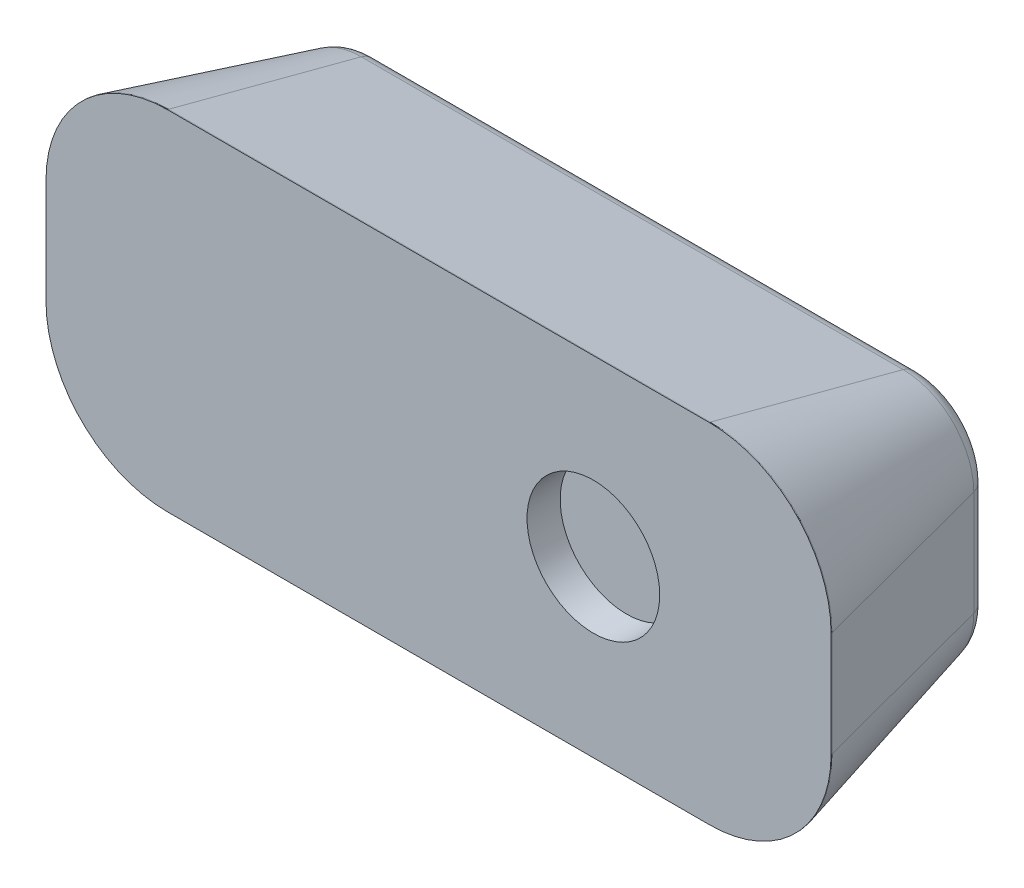
ISO-10303-21;
HEADER;
FILE_DESCRIPTION(('STEP AP214'),'2;1');
FILE_NAME('part.step','',(''),(''),'','','');
FILE_SCHEMA(('AUTOMOTIVE_DESIGN { 1 0 10303 214 1 1 1 1 }'));
ENDSEC;
DATA;
#1=APPLICATION_CONTEXT('core data for automotive mechanical design processes');
#2=APPLICATION_PROTOCOL_DEFINITION('international standard','automotive_design',2000,#1);
#3=PRODUCT_CONTEXT('',#1,'mechanical');
#4=PRODUCT('Part','Part','',(#3));
#5=PRODUCT_RELATED_PRODUCT_CATEGORY('part','',(#4));
#6=PRODUCT_DEFINITION_FORMATION('','',#4);
#7=PRODUCT_DEFINITION_CONTEXT('part definition',#1,'design');
#8=PRODUCT_DEFINITION('design','',#6,#7);
#9=PRODUCT_DEFINITION_SHAPE('','',#8);
#10=(LENGTH_UNIT() NAMED_UNIT(*) SI_UNIT(.MILLI.,.METRE.));
#11=(NAMED_UNIT(*) PLANE_ANGLE_UNIT() SI_UNIT($,.RADIAN.));
#12=(NAMED_UNIT(*) SI_UNIT($,.STERADIAN.) SOLID_ANGLE_UNIT());
#13=UNCERTAINTY_MEASURE_WITH_UNIT(LENGTH_MEASURE(1.E-05),#10,'distance_accuracy_value','');
#14=(GEOMETRIC_REPRESENTATION_CONTEXT(3) GLOBAL_UNCERTAINTY_ASSIGNED_CONTEXT((#13)) GLOBAL_UNIT_ASSIGNED_CONTEXT((#10,
#11,#12)) REPRESENTATION_CONTEXT('',''));
#15=CARTESIAN_POINT('',(0.,0.,0.));
#16=DIRECTION('',(0.,0.,1.));
#17=DIRECTION('',(1.,0.,0.));
#18=AXIS2_PLACEMENT_3D('',#15,#16,#17);
#19=CARTESIAN_POINT('',(-35.5,-15.75,9.5));
#20=DIRECTION('',(1.,0.,0.));
#21=DIRECTION('',(0.,0.,-1.));
#22=AXIS2_PLACEMENT_3D('',#19,#20,#21);
#23=PLANE('',#22);
#24=DIRECTION('',(0.,0.,-1.));
#25=VECTOR('',#24,1.);
#26=CARTESIAN_POINT('',(-35.5,4.75,9.5));
#27=LINE('',#26,#25);
#28=CARTESIAN_POINT('',(-35.5,4.75,9.5));
#29=VERTEX_POINT('',#28);
#30=CARTESIAN_POINT('',(-35.5,4.75,9.42424044182955));
#31=VERTEX_POINT('',#30);
#32=EDGE_CURVE('E230',#29,#31,#27,.T.);
#33=ORIENTED_EDGE('',*,*,#32,.T.);
#34=DIRECTION('',(0.,-1.,0.));
#35=VECTOR('',#34,1.);
#36=CARTESIAN_POINT('',(-35.5,-15.75,9.42424044182955));
#37=LINE('',#36,#35);
#38=CARTESIAN_POINT('',(-35.5,-4.75,9.42424044182955));
#39=VERTEX_POINT('',#38);
#40=EDGE_CURVE('E264',#31,#39,#37,.T.);
#41=ORIENTED_EDGE('',*,*,#40,.T.);
#42=DIRECTION('',(0.,0.,-1.));
#43=VECTOR('',#42,1.);
#44=CARTESIAN_POINT('',(-35.5,-4.75,9.5));
#45=LINE('',#44,#43);
#46=CARTESIAN_POINT('',(-35.5,-4.75,9.5));
#47=VERTEX_POINT('',#46);
#48=EDGE_CURVE('E233',#39,#47,#45,.F.);
#49=ORIENTED_EDGE('',*,*,#48,.T.);
#50=DIRECTION('',(0.,-1.,0.));
#51=VECTOR('',#50,1.);
#52=CARTESIAN_POINT('',(-35.5,-15.75,9.5));
#53=LINE('',#52,#51);
#54=EDGE_CURVE('E212',#29,#47,#53,.T.);
#55=ORIENTED_EDGE('',*,*,#54,.F.);
#56=EDGE_LOOP('',(#33,#41,#49,#55));
#57=FACE_BOUND('',#56,.T.);
#58=ADVANCED_FACE('F32',(#57),#23,.F.);
#59=CARTESIAN_POINT('',(35.5,-15.75,9.5));
#60=DIRECTION('',(0.,1.,0.));
#61=DIRECTION('',(-1.,0.,0.));
#62=AXIS2_PLACEMENT_3D('',#59,#60,#61);
#63=PLANE('',#62);
#64=DIRECTION('',(0.,0.,-1.));
#65=VECTOR('',#64,1.);
#66=CARTESIAN_POINT('',(-24.5,-15.75,9.5));
#67=LINE('',#66,#65);
#68=CARTESIAN_POINT('',(-24.5,-15.75,9.5));
#69=VERTEX_POINT('',#68);
#70=CARTESIAN_POINT('',(-24.5,-15.75,9.42424044182955));
#71=VERTEX_POINT('',#70);
#72=EDGE_CURVE('E227',#69,#71,#67,.T.);
#73=ORIENTED_EDGE('',*,*,#72,.T.);
#74=DIRECTION('',(1.,0.,0.));
#75=VECTOR('',#74,1.);
#76=CARTESIAN_POINT('',(35.5,-15.75,9.42424044182955));
#77=LINE('',#76,#75);
#78=CARTESIAN_POINT('',(24.5,-15.75,9.42424044182955));
#79=VERTEX_POINT('',#78);
#80=EDGE_CURVE('E253',#71,#79,#77,.T.);
#81=ORIENTED_EDGE('',*,*,#80,.T.);
#82=DIRECTION('',(0.,0.,-1.));
#83=VECTOR('',#82,1.);
#84=CARTESIAN_POINT('',(24.5,-15.75,9.5));
#85=LINE('',#84,#83);
#86=CARTESIAN_POINT('',(24.5,-15.75,9.5));
#87=VERTEX_POINT('',#86);
#88=EDGE_CURVE('E225',#79,#87,#85,.F.);
#89=ORIENTED_EDGE('',*,*,#88,.T.);
#90=DIRECTION('',(1.,0.,0.));
#91=VECTOR('',#90,1.);
#92=CARTESIAN_POINT('',(35.5,-15.75,9.5));
#93=LINE('',#92,#91);
#94=EDGE_CURVE('E215',#69,#87,#93,.T.);
#95=ORIENTED_EDGE('',*,*,#94,.F.);
#96=EDGE_LOOP('',(#73,#81,#89,#95));
#97=FACE_BOUND('',#96,.T.);
#98=ADVANCED_FACE('F397',(#97),#63,.F.);
#99=CARTESIAN_POINT('',(35.5,-15.75,9.5));
#100=DIRECTION('',(-1.,0.,0.));
#101=DIRECTION('',(0.,0.,1.));
#102=AXIS2_PLACEMENT_3D('',#99,#100,#101);
#103=PLANE('',#102);
#104=DIRECTION('',(0.,0.,-1.));
#105=VECTOR('',#104,1.);
#106=CARTESIAN_POINT('',(35.5,-4.75,9.5));
#107=LINE('',#106,#105);
#108=CARTESIAN_POINT('',(35.5,-4.75,9.5));
#109=VERTEX_POINT('',#108);
#110=CARTESIAN_POINT('',(35.5,-4.75,9.42424044182955));
#111=VERTEX_POINT('',#110);
#112=EDGE_CURVE('E250',#109,#111,#107,.T.);
#113=ORIENTED_EDGE('',*,*,#112,.T.);
#114=DIRECTION('',(0.,1.,0.));
#115=VECTOR('',#114,1.);
#116=CARTESIAN_POINT('',(35.5,-15.75,9.42424044182955));
#117=LINE('',#116,#115);
#118=CARTESIAN_POINT('',(35.5,4.75000000000001,9.42424044182955));
#119=VERTEX_POINT('',#118);
#120=EDGE_CURVE('E261',#111,#119,#117,.T.);
#121=ORIENTED_EDGE('',*,*,#120,.T.);
#122=DIRECTION('',(0.,0.,-1.));
#123=VECTOR('',#122,1.);
#124=CARTESIAN_POINT('',(35.5,4.75000000000001,9.5));
#125=LINE('',#124,#123);
#126=CARTESIAN_POINT('',(35.5,4.75000000000001,9.5));
#127=VERTEX_POINT('',#126);
#128=EDGE_CURVE('E248',#119,#127,#125,.F.);
#129=ORIENTED_EDGE('',*,*,#128,.T.);
#130=DIRECTION('',(0.,1.,0.));
#131=VECTOR('',#130,1.);
#132=CARTESIAN_POINT('',(35.5,-15.75,9.5));
#133=LINE('',#132,#131);
#134=EDGE_CURVE('E219',#109,#127,#133,.T.);
#135=ORIENTED_EDGE('',*,*,#134,.F.);
#136=EDGE_LOOP('',(#113,#121,#129,#135));
#137=FACE_BOUND('',#136,.T.);
#138=ADVANCED_FACE('F403',(#137),#103,.F.);
#139=CARTESIAN_POINT('',(35.5,15.75,9.5));
#140=DIRECTION('',(0.,-1.,0.));
#141=DIRECTION('',(1.,0.,0.));
#142=AXIS2_PLACEMENT_3D('',#139,#140,#141);
#143=PLANE('',#142);
#144=DIRECTION('',(0.,0.,-1.));
#145=VECTOR('',#144,1.);
#146=CARTESIAN_POINT('',(24.5,15.75,9.5));
#147=LINE('',#146,#145);
#148=CARTESIAN_POINT('',(24.5,15.75,9.5));
#149=VERTEX_POINT('',#148);
#150=CARTESIAN_POINT('',(24.5,15.75,9.42424044182955));
#151=VERTEX_POINT('',#150);
#152=EDGE_CURVE('E243',#149,#151,#147,.T.);
#153=ORIENTED_EDGE('',*,*,#152,.T.);
#154=DIRECTION('',(-1.,0.,0.));
#155=VECTOR('',#154,1.);
#156=CARTESIAN_POINT('',(35.5,15.75,9.42424044182955));
#157=LINE('',#156,#155);
#158=CARTESIAN_POINT('',(-24.5,15.75,9.42424044182955));
#159=VERTEX_POINT('',#158);
#160=EDGE_CURVE('E271',#151,#159,#157,.T.);
#161=ORIENTED_EDGE('',*,*,#160,.T.);
#162=DIRECTION('',(0.,0.,-1.));
#163=VECTOR('',#162,1.);
#164=CARTESIAN_POINT('',(-24.5,15.75,9.5));
#165=LINE('',#164,#163);
#166=CARTESIAN_POINT('',(-24.5,15.75,9.5));
#167=VERTEX_POINT('',#166);
#168=EDGE_CURVE('E246',#159,#167,#165,.F.);
#169=ORIENTED_EDGE('',*,*,#168,.T.);
#170=DIRECTION('',(-1.,0.,0.));
#171=VECTOR('',#170,1.);
#172=CARTESIAN_POINT('',(35.5,15.75,9.5));
#173=LINE('',#172,#171);
#174=EDGE_CURVE('E222',#149,#167,#173,.T.);
#175=ORIENTED_EDGE('',*,*,#174,.F.);
#176=EDGE_LOOP('',(#153,#161,#169,#175));
#177=FACE_BOUND('',#176,.T.);
#178=ADVANCED_FACE('F645',(#177),#143,.F.);
#179=CARTESIAN_POINT('',(0.,0.,9.5));
#180=DIRECTION('',(0.,0.,1.));
#181=DIRECTION('',(1.,0.,0.));
#182=AXIS2_PLACEMENT_3D('',#179,#180,#181);
#183=PLANE('',#182);
#184=CARTESIAN_POINT('',(14.,0.,9.5));
#185=DIRECTION('',(0.,0.,1.));
#186=DIRECTION('',(1.,0.,0.));
#187=AXIS2_PLACEMENT_3D('',#184,#185,#186);
#188=CIRCLE('',#187,6.);
#189=CARTESIAN_POINT('',(20.,0.,9.5));
#190=VERTEX_POINT('',#189);
#191=EDGE_CURVE('E367',#190,#190,#188,.T.);
#192=ORIENTED_EDGE('',*,*,#191,.F.);
#193=EDGE_LOOP('',(#192));
#194=FACE_BOUND('',#193,.T.);
#195=ORIENTED_EDGE('',*,*,#54,.T.);
#196=CARTESIAN_POINT('',(-24.5,-4.75,9.5));
#197=DIRECTION('',(0.,0.,1.));
#198=DIRECTION('',(1.,0.,0.));
#199=AXIS2_PLACEMENT_3D('',#196,#197,#198);
#200=CIRCLE('',#199,11.);
#201=EDGE_CURVE('E241',#47,#69,#200,.T.);
#202=ORIENTED_EDGE('',*,*,#201,.T.);
#203=ORIENTED_EDGE('',*,*,#94,.T.);
#204=CARTESIAN_POINT('',(24.5,-4.75,9.5));
#205=DIRECTION('',(0.,0.,1.));
#206=DIRECTION('',(1.,0.,0.));
#207=AXIS2_PLACEMENT_3D('',#204,#205,#206);
#208=CIRCLE('',#207,11.);
#209=EDGE_CURVE('E237',#87,#109,#208,.T.);
#210=ORIENTED_EDGE('',*,*,#209,.T.);
#211=ORIENTED_EDGE('',*,*,#134,.T.);
#212=CARTESIAN_POINT('',(24.5,4.75000000000001,9.5));
#213=DIRECTION('',(0.,0.,1.));
#214=DIRECTION('',(1.,0.,0.));
#215=AXIS2_PLACEMENT_3D('',#212,#213,#214);
#216=CIRCLE('',#215,11.);
#217=EDGE_CURVE('E235',#127,#149,#216,.T.);
#218=ORIENTED_EDGE('',*,*,#217,.T.);
#219=ORIENTED_EDGE('',*,*,#174,.T.);
#220=CARTESIAN_POINT('',(-24.5,4.75,9.5));
#221=DIRECTION('',(0.,0.,1.));
#222=DIRECTION('',(1.,0.,0.));
#223=AXIS2_PLACEMENT_3D('',#220,#221,#222);
#224=CIRCLE('',#223,11.);
#225=EDGE_CURVE('E239',#167,#29,#224,.T.);
#226=ORIENTED_EDGE('',*,*,#225,.T.);
#227=EDGE_LOOP('',(#195,#202,#203,#210,#211,#218,#219,#226));
#228=FACE_BOUND('',#227,.T.);
#229=ADVANCED_FACE('F484',(#194,#228),#183,.T.);
#230=CARTESIAN_POINT('',(0.,0.,-9.5));
#231=DIRECTION('',(0.,0.,1.));
#232=DIRECTION('',(1.,0.,0.));
#233=AXIS2_PLACEMENT_3D('',#230,#231,#232);
#234=PLANE('',#233);
#235=DIRECTION('',(0.,-1.,0.));
#236=VECTOR('',#235,1.);
#237=CARTESIAN_POINT('',(-28.9597926553289,4.75,-9.5));
#238=LINE('',#237,#236);
#239=CARTESIAN_POINT('',(-28.9597926553289,-4.75,-9.5));
#240=VERTEX_POINT('',#239);
#241=CARTESIAN_POINT('',(-28.9597926553289,4.75,-9.5));
#242=VERTEX_POINT('',#241);
#243=EDGE_CURVE('E315',#240,#242,#238,.F.);
#244=ORIENTED_EDGE('',*,*,#243,.T.);
#245=CARTESIAN_POINT('',(-24.5,4.75,-9.5));
#246=DIRECTION('',(0.,0.,1.));
#247=DIRECTION('',(1.,0.,0.));
#248=AXIS2_PLACEMENT_3D('',#245,#246,#247);
#249=CIRCLE('',#248,4.45979265532887);
#250=CARTESIAN_POINT('',(-24.5,9.20979265532887,-9.5));
#251=VERTEX_POINT('',#250);
#252=EDGE_CURVE('E317',#242,#251,#249,.F.);
#253=ORIENTED_EDGE('',*,*,#252,.T.);
#254=DIRECTION('',(-1.,0.,0.));
#255=VECTOR('',#254,1.);
#256=CARTESIAN_POINT('',(24.5,9.20979265532887,-9.5));
#257=LINE('',#256,#255);
#258=CARTESIAN_POINT('',(24.5,9.20979265532887,-9.5));
#259=VERTEX_POINT('',#258);
#260=EDGE_CURVE('E302',#251,#259,#257,.F.);
#261=ORIENTED_EDGE('',*,*,#260,.T.);
#262=CARTESIAN_POINT('',(24.5,4.75000000000001,-9.5));
#263=DIRECTION('',(0.,0.,1.));
#264=DIRECTION('',(1.,0.,0.));
#265=AXIS2_PLACEMENT_3D('',#262,#263,#264);
#266=CIRCLE('',#265,4.45979265532887);
#267=CARTESIAN_POINT('',(28.9597926553289,4.75000000000001,-9.5));
#268=VERTEX_POINT('',#267);
#269=EDGE_CURVE('E305',#259,#268,#266,.F.);
#270=ORIENTED_EDGE('',*,*,#269,.T.);
#271=DIRECTION('',(0.,1.,0.));
#272=VECTOR('',#271,1.);
#273=CARTESIAN_POINT('',(28.9597926553289,-4.75,-9.5));
#274=LINE('',#273,#272);
#275=CARTESIAN_POINT('',(28.9597926553289,-4.75,-9.5));
#276=VERTEX_POINT('',#275);
#277=EDGE_CURVE('E307',#268,#276,#274,.F.);
#278=ORIENTED_EDGE('',*,*,#277,.T.);
#279=CARTESIAN_POINT('',(24.5,-4.75,-9.5));
#280=DIRECTION('',(0.,0.,1.));
#281=DIRECTION('',(1.,0.,0.));
#282=AXIS2_PLACEMENT_3D('',#279,#280,#281);
#283=CIRCLE('',#282,4.45979265532887);
#284=CARTESIAN_POINT('',(24.5,-9.20979265532886,-9.5));
#285=VERTEX_POINT('',#284);
#286=EDGE_CURVE('E309',#276,#285,#283,.F.);
#287=ORIENTED_EDGE('',*,*,#286,.T.);
#288=DIRECTION('',(1.,0.,0.));
#289=VECTOR('',#288,1.);
#290=CARTESIAN_POINT('',(-24.5,-9.20979265532887,-9.5));
#291=LINE('',#290,#289);
#292=CARTESIAN_POINT('',(-24.5,-9.20979265532887,-9.5));
#293=VERTEX_POINT('',#292);
#294=EDGE_CURVE('E311',#285,#293,#291,.F.);
#295=ORIENTED_EDGE('',*,*,#294,.T.);
#296=CARTESIAN_POINT('',(-24.5,-4.75,-9.5));
#297=DIRECTION('',(0.,0.,1.));
#298=DIRECTION('',(1.,0.,0.));
#299=AXIS2_PLACEMENT_3D('',#296,#297,#298);
#300=CIRCLE('',#299,4.45979265532887);
#301=EDGE_CURVE('E313',#293,#240,#300,.F.);
#302=ORIENTED_EDGE('',*,*,#301,.T.);
#303=EDGE_LOOP('',(#244,#253,#261,#270,#278,#287,#295,#302));
#304=FACE_BOUND('',#303,.T.);
#305=DIRECTION('',(-1.,0.,0.));
#306=VECTOR('',#305,1.);
#307=CARTESIAN_POINT('',(7.,-3.5,-9.5));
#308=LINE('',#307,#306);
#309=CARTESIAN_POINT('',(7.,-3.5,-9.5));
#310=VERTEX_POINT('',#309);
#311=CARTESIAN_POINT('',(0.,-3.5,-9.5));
#312=VERTEX_POINT('',#311);
#313=EDGE_CURVE('E195',#310,#312,#308,.T.);
#314=ORIENTED_EDGE('',*,*,#313,.F.);
#315=DIRECTION('',(0.,-1.,0.));
#316=VECTOR('',#315,1.);
#317=CARTESIAN_POINT('',(7.,-3.5,-9.5));
#318=LINE('',#317,#316);
#319=CARTESIAN_POINT('',(7.,3.5,-9.5));
#320=VERTEX_POINT('',#319);
#321=EDGE_CURVE('E186',#320,#310,#318,.T.);
#322=ORIENTED_EDGE('',*,*,#321,.F.);
#323=DIRECTION('',(-1.,0.,0.));
#324=VECTOR('',#323,1.);
#325=CARTESIAN_POINT('',(7.,3.5,-9.5));
#326=LINE('',#325,#324);
#327=CARTESIAN_POINT('',(0.,3.5,-9.5));
#328=VERTEX_POINT('',#327);
#329=EDGE_CURVE('E180',#320,#328,#326,.T.);
#330=ORIENTED_EDGE('',*,*,#329,.T.);
#331=DIRECTION('',(0.,-1.,0.));
#332=VECTOR('',#331,1.);
#333=CARTESIAN_POINT('',(0.,-3.5,-9.5));
#334=LINE('',#333,#332);
#335=EDGE_CURVE('E192',#328,#312,#334,.T.);
#336=ORIENTED_EDGE('',*,*,#335,.T.);
#337=EDGE_LOOP('',(#314,#322,#330,#336));
#338=FACE_BOUND('',#337,.T.);
#339=ADVANCED_FACE('F191',(#304,#338),#234,.F.);
#340=CARTESIAN_POINT('',(-24.5,-4.75,9.5));
#341=DIRECTION('',(0.,0.,-1.));
#342=DIRECTION('',(-1.,0.,0.));
#343=AXIS2_PLACEMENT_3D('',#340,#341,#342);
#344=CYLINDRICAL_SURFACE('',#343,11.);
#345=ORIENTED_EDGE('',*,*,#48,.F.);
#346=CARTESIAN_POINT('',(-24.5,-4.75,9.42424044182955));
#347=DIRECTION('',(0.,0.,1.));
#348=DIRECTION('',(1.,0.,0.));
#349=AXIS2_PLACEMENT_3D('',#346,#347,#348);
#350=CIRCLE('',#349,11.);
#351=EDGE_CURVE('E259',#39,#71,#350,.T.);
#352=ORIENTED_EDGE('',*,*,#351,.T.);
#353=ORIENTED_EDGE('',*,*,#72,.F.);
#354=ORIENTED_EDGE('',*,*,#201,.F.);
#355=EDGE_LOOP('',(#345,#352,#353,#354));
#356=FACE_BOUND('',#355,.T.);
#357=ADVANCED_FACE('F408',(#356),#344,.T.);
#358=CARTESIAN_POINT('',(-24.5,4.75,9.5));
#359=DIRECTION('',(0.,0.,-1.));
#360=DIRECTION('',(-1.,0.,0.));
#361=AXIS2_PLACEMENT_3D('',#358,#359,#360);
#362=CYLINDRICAL_SURFACE('',#361,11.);
#363=ORIENTED_EDGE('',*,*,#168,.F.);
#364=CARTESIAN_POINT('',(-24.5,4.75,9.42424044182955));
#365=DIRECTION('',(0.,0.,1.));
#366=DIRECTION('',(1.,0.,0.));
#367=AXIS2_PLACEMENT_3D('',#364,#365,#366);
#368=CIRCLE('',#367,11.);
#369=EDGE_CURVE('E269',#159,#31,#368,.T.);
#370=ORIENTED_EDGE('',*,*,#369,.T.);
#371=ORIENTED_EDGE('',*,*,#32,.F.);
#372=ORIENTED_EDGE('',*,*,#225,.F.);
#373=EDGE_LOOP('',(#363,#370,#371,#372));
#374=FACE_BOUND('',#373,.T.);
#375=ADVANCED_FACE('F411',(#374),#362,.T.);
#376=CARTESIAN_POINT('',(24.5,-4.75,9.5));
#377=DIRECTION('',(0.,0.,-1.));
#378=DIRECTION('',(-1.,0.,0.));
#379=AXIS2_PLACEMENT_3D('',#376,#377,#378);
#380=CYLINDRICAL_SURFACE('',#379,11.);
#381=ORIENTED_EDGE('',*,*,#88,.F.);
#382=CARTESIAN_POINT('',(24.5,-4.75,9.42424044182955));
#383=DIRECTION('',(0.,0.,1.));
#384=DIRECTION('',(1.,0.,0.));
#385=AXIS2_PLACEMENT_3D('',#382,#383,#384);
#386=CIRCLE('',#385,11.);
#387=EDGE_CURVE('E256',#79,#111,#386,.T.);
#388=ORIENTED_EDGE('',*,*,#387,.T.);
#389=ORIENTED_EDGE('',*,*,#112,.F.);
#390=ORIENTED_EDGE('',*,*,#209,.F.);
#391=EDGE_LOOP('',(#381,#388,#389,#390));
#392=FACE_BOUND('',#391,.T.);
#393=ADVANCED_FACE('F415',(#392),#380,.T.);
#394=CARTESIAN_POINT('',(24.5,4.75000000000001,9.5));
#395=DIRECTION('',(0.,0.,-1.));
#396=DIRECTION('',(-1.,0.,0.));
#397=AXIS2_PLACEMENT_3D('',#394,#395,#396);
#398=CYLINDRICAL_SURFACE('',#397,11.);
#399=ORIENTED_EDGE('',*,*,#128,.F.);
#400=CARTESIAN_POINT('',(24.5,4.75000000000001,9.42424044182955));
#401=DIRECTION('',(0.,0.,1.));
#402=DIRECTION('',(1.,0.,0.));
#403=AXIS2_PLACEMENT_3D('',#400,#401,#402);
#404=CIRCLE('',#403,11.);
#405=EDGE_CURVE('E266',#119,#151,#404,.T.);
#406=ORIENTED_EDGE('',*,*,#405,.T.);
#407=ORIENTED_EDGE('',*,*,#152,.F.);
#408=ORIENTED_EDGE('',*,*,#217,.F.);
#409=EDGE_LOOP('',(#399,#406,#407,#408));
#410=FACE_BOUND('',#409,.T.);
#411=ADVANCED_FACE('F419',(#410),#398,.T.);
#412=CARTESIAN_POINT('',(35.5,15.75,9.42424044182955));
#413=DIRECTION('',(0.,-0.966823388604459,0.255445757935791));
#414=DIRECTION('',(-1.,0.,0.));
#415=AXIS2_PLACEMENT_3D('',#412,#413,#414);
#416=PLANE('',#415);
#417=DIRECTION('',(0.,0.255445757935791,0.966823388604459));
#418=VECTOR('',#417,1.);
#419=CARTESIAN_POINT('',(24.5,10.75,-9.5));
#420=LINE('',#419,#418);
#421=CARTESIAN_POINT('',(24.5,11.1434394325378,-8.01089151587158));
#422=VERTEX_POINT('',#421);
#423=EDGE_CURVE('E288',#422,#151,#420,.T.);
#424=ORIENTED_EDGE('',*,*,#423,.F.);
#425=DIRECTION('',(1.,0.,0.));
#426=VECTOR('',#425,1.);
#427=CARTESIAN_POINT('',(-24.5,11.1434394325378,-8.01089151587158));
#428=LINE('',#427,#426);
#429=CARTESIAN_POINT('',(-24.5,11.1434394325378,-8.01089151587158));
#430=VERTEX_POINT('',#429);
#431=EDGE_CURVE('E11',#422,#430,#428,.F.);
#432=ORIENTED_EDGE('',*,*,#431,.T.);
#433=DIRECTION('',(0.,-0.255445757935791,-0.966823388604459));
#434=VECTOR('',#433,1.);
#435=CARTESIAN_POINT('',(-24.5,15.75,9.42424044182955));
#436=LINE('',#435,#434);
#437=EDGE_CURVE('E216',#159,#430,#436,.T.);
#438=ORIENTED_EDGE('',*,*,#437,.F.);
#439=ORIENTED_EDGE('',*,*,#160,.F.);
#440=EDGE_LOOP('',(#424,#432,#438,#439));
#441=FACE_BOUND('',#440,.T.);
#442=ADVANCED_FACE('F423',(#441),#416,.F.);
#443=CARTESIAN_POINT('',(-24.5,4.75,-9.5));
#444=DIRECTION('',(0.,0.,1.));
#445=DIRECTION('',(1.,0.,0.));
#446=AXIS2_PLACEMENT_3D('',#443,#444,#445);
#447=CONICAL_SURFACE('',#446,5.99999999999999,0.258308729295161);
#448=ORIENTED_EDGE('',*,*,#437,.T.);
#449=CARTESIAN_POINT('',(-24.5,4.75,-8.01089151587158));
#450=DIRECTION('',(0.,0.,1.));
#451=DIRECTION('',(1.,0.,0.));
#452=AXIS2_PLACEMENT_3D('',#449,#450,#451);
#453=CIRCLE('',#452,6.39343943253778);
#454=CARTESIAN_POINT('',(-30.8934394325378,4.75,-8.01089151587158));
#455=VERTEX_POINT('',#454);
#456=EDGE_CURVE('E320',#430,#455,#453,.T.);
#457=ORIENTED_EDGE('',*,*,#456,.T.);
#458=DIRECTION('',(0.255445757935791,0.,-0.966823388604459));
#459=VECTOR('',#458,1.);
#460=CARTESIAN_POINT('',(-35.5,4.75,9.42424044182955));
#461=LINE('',#460,#459);
#462=EDGE_CURVE('E285',#31,#455,#461,.T.);
#463=ORIENTED_EDGE('',*,*,#462,.F.);
#464=ORIENTED_EDGE('',*,*,#369,.F.);
#465=EDGE_LOOP('',(#448,#457,#463,#464));
#466=FACE_BOUND('',#465,.T.);
#467=ADVANCED_FACE('F447',(#466),#447,.T.);
#468=CARTESIAN_POINT('',(24.5,4.75000000000001,-9.5));
#469=DIRECTION('',(0.,0.,1.));
#470=DIRECTION('',(1.,0.,0.));
#471=AXIS2_PLACEMENT_3D('',#468,#469,#470);
#472=CONICAL_SURFACE('',#471,5.99999999999999,0.258308729295161);
#473=DIRECTION('',(0.255445757935791,0.,0.966823388604459));
#474=VECTOR('',#473,1.);
#475=CARTESIAN_POINT('',(30.5,4.75000000000001,-9.5));
#476=LINE('',#475,#474);
#477=CARTESIAN_POINT('',(30.8934394325378,4.75000000000001,-8.01089151587158));
#478=VERTEX_POINT('',#477);
#479=EDGE_CURVE('E283',#478,#119,#476,.T.);
#480=ORIENTED_EDGE('',*,*,#479,.F.);
#481=CARTESIAN_POINT('',(24.5,4.75000000000001,-8.01089151587158));
#482=DIRECTION('',(0.,0.,1.));
#483=DIRECTION('',(1.,0.,0.));
#484=AXIS2_PLACEMENT_3D('',#481,#482,#483);
#485=CIRCLE('',#484,6.39343943253778);
#486=EDGE_CURVE('E41',#478,#422,#485,.T.);
#487=ORIENTED_EDGE('',*,*,#486,.T.);
#488=ORIENTED_EDGE('',*,*,#423,.T.);
#489=ORIENTED_EDGE('',*,*,#405,.F.);
#490=EDGE_LOOP('',(#480,#487,#488,#489));
#491=FACE_BOUND('',#490,.T.);
#492=ADVANCED_FACE('F443',(#491),#472,.T.);
#493=CARTESIAN_POINT('',(-35.5,-15.75,9.42424044182955));
#494=DIRECTION('',(0.966823388604459,0.,0.255445757935791));
#495=DIRECTION('',(0.,-1.,0.));
#496=AXIS2_PLACEMENT_3D('',#493,#494,#495);
#497=PLANE('',#496);
#498=ORIENTED_EDGE('',*,*,#462,.T.);
#499=DIRECTION('',(0.,1.,0.));
#500=VECTOR('',#499,1.);
#501=CARTESIAN_POINT('',(-30.8934394325378,-4.75,-8.01089151587158));
#502=LINE('',#501,#500);
#503=CARTESIAN_POINT('',(-30.8934394325378,-4.75,-8.01089151587158));
#504=VERTEX_POINT('',#503);
#505=EDGE_CURVE('E323',#455,#504,#502,.F.);
#506=ORIENTED_EDGE('',*,*,#505,.T.);
#507=DIRECTION('',(0.255445757935791,0.,-0.966823388604459));
#508=VECTOR('',#507,1.);
#509=CARTESIAN_POINT('',(-35.5,-4.75,9.42424044182955));
#510=LINE('',#509,#508);
#511=EDGE_CURVE('E280',#39,#504,#510,.T.);
#512=ORIENTED_EDGE('',*,*,#511,.F.);
#513=ORIENTED_EDGE('',*,*,#40,.F.);
#514=EDGE_LOOP('',(#498,#506,#512,#513));
#515=FACE_BOUND('',#514,.T.);
#516=ADVANCED_FACE('F440',(#515),#497,.F.);
#517=CARTESIAN_POINT('',(35.5,-15.75,9.42424044182955));
#518=DIRECTION('',(-0.966823388604459,0.,0.255445757935791));
#519=DIRECTION('',(0.,1.,0.));
#520=AXIS2_PLACEMENT_3D('',#517,#518,#519);
#521=PLANE('',#520);
#522=DIRECTION('',(0.255445757935791,0.,0.966823388604459));
#523=VECTOR('',#522,1.);
#524=CARTESIAN_POINT('',(30.5,-4.75,-9.5));
#525=LINE('',#524,#523);
#526=CARTESIAN_POINT('',(30.8934394325378,-4.75,-8.01089151587158));
#527=VERTEX_POINT('',#526);
#528=EDGE_CURVE('E278',#527,#111,#525,.T.);
#529=ORIENTED_EDGE('',*,*,#528,.F.);
#530=DIRECTION('',(0.,-1.,0.));
#531=VECTOR('',#530,1.);
#532=CARTESIAN_POINT('',(30.8934394325378,4.75000000000001,-8.01089151587158));
#533=LINE('',#532,#531);
#534=EDGE_CURVE('E56',#527,#478,#533,.F.);
#535=ORIENTED_EDGE('',*,*,#534,.T.);
#536=ORIENTED_EDGE('',*,*,#479,.T.);
#537=ORIENTED_EDGE('',*,*,#120,.F.);
#538=EDGE_LOOP('',(#529,#535,#536,#537));
#539=FACE_BOUND('',#538,.T.);
#540=ADVANCED_FACE('F436',(#539),#521,.F.);
#541=CARTESIAN_POINT('',(-24.5,-4.75,-9.5));
#542=DIRECTION('',(0.,0.,1.));
#543=DIRECTION('',(1.,0.,0.));
#544=AXIS2_PLACEMENT_3D('',#541,#542,#543);
#545=CONICAL_SURFACE('',#544,5.99999999999999,0.258308729295161);
#546=ORIENTED_EDGE('',*,*,#511,.T.);
#547=CARTESIAN_POINT('',(-24.5,-4.75,-8.01089151587158));
#548=DIRECTION('',(0.,0.,1.));
#549=DIRECTION('',(1.,0.,0.));
#550=AXIS2_PLACEMENT_3D('',#547,#548,#549);
#551=CIRCLE('',#550,6.39343943253778);
#552=CARTESIAN_POINT('',(-24.5,-11.1434394325378,-8.01089151587158));
#553=VERTEX_POINT('',#552);
#554=EDGE_CURVE('E325',#504,#553,#551,.T.);
#555=ORIENTED_EDGE('',*,*,#554,.T.);
#556=DIRECTION('',(0.,0.255445757935791,-0.966823388604459));
#557=VECTOR('',#556,1.);
#558=CARTESIAN_POINT('',(-24.5,-15.75,9.42424044182955));
#559=LINE('',#558,#557);
#560=EDGE_CURVE('E275',#71,#553,#559,.T.);
#561=ORIENTED_EDGE('',*,*,#560,.F.);
#562=ORIENTED_EDGE('',*,*,#351,.F.);
#563=EDGE_LOOP('',(#546,#555,#561,#562));
#564=FACE_BOUND('',#563,.T.);
#565=ADVANCED_FACE('F432',(#564),#545,.T.);
#566=CARTESIAN_POINT('',(24.5,-4.75,-9.5));
#567=DIRECTION('',(0.,0.,1.));
#568=DIRECTION('',(1.,0.,0.));
#569=AXIS2_PLACEMENT_3D('',#566,#567,#568);
#570=CONICAL_SURFACE('',#569,5.99999999999999,0.258308729295161);
#571=DIRECTION('',(0.,-0.255445757935791,0.966823388604459));
#572=VECTOR('',#571,1.);
#573=CARTESIAN_POINT('',(24.5,-10.75,-9.5));
#574=LINE('',#573,#572);
#575=CARTESIAN_POINT('',(24.5,-11.1434394325378,-8.01089151587158));
#576=VERTEX_POINT('',#575);
#577=EDGE_CURVE('E211',#576,#79,#574,.T.);
#578=ORIENTED_EDGE('',*,*,#577,.F.);
#579=CARTESIAN_POINT('',(24.5,-4.75,-8.01089151587158));
#580=DIRECTION('',(0.,0.,1.));
#581=DIRECTION('',(1.,0.,0.));
#582=AXIS2_PLACEMENT_3D('',#579,#580,#581);
#583=CIRCLE('',#582,6.39343943253778);
#584=EDGE_CURVE('E329',#576,#527,#583,.T.);
#585=ORIENTED_EDGE('',*,*,#584,.T.);
#586=ORIENTED_EDGE('',*,*,#528,.T.);
#587=ORIENTED_EDGE('',*,*,#387,.F.);
#588=EDGE_LOOP('',(#578,#585,#586,#587));
#589=FACE_BOUND('',#588,.T.);
#590=ADVANCED_FACE('F428',(#589),#570,.T.);
#591=CARTESIAN_POINT('',(35.5,-15.75,9.42424044182955));
#592=DIRECTION('',(0.,0.966823388604459,0.255445757935791));
#593=DIRECTION('',(1.,0.,0.));
#594=AXIS2_PLACEMENT_3D('',#591,#592,#593);
#595=PLANE('',#594);
#596=ORIENTED_EDGE('',*,*,#560,.T.);
#597=DIRECTION('',(-1.,0.,0.));
#598=VECTOR('',#597,1.);
#599=CARTESIAN_POINT('',(24.5,-11.1434394325378,-8.01089151587158));
#600=LINE('',#599,#598);
#601=EDGE_CURVE('E327',#553,#576,#600,.F.);
#602=ORIENTED_EDGE('',*,*,#601,.T.);
#603=ORIENTED_EDGE('',*,*,#577,.T.);
#604=ORIENTED_EDGE('',*,*,#80,.F.);
#605=EDGE_LOOP('',(#596,#602,#603,#604));
#606=FACE_BOUND('',#605,.T.);
#607=ADVANCED_FACE('F425',(#606),#595,.F.);
#608=CARTESIAN_POINT('',(7.,-3.5,-15.));
#609=DIRECTION('',(0.,1.,0.));
#610=DIRECTION('',(0.,0.,1.));
#611=AXIS2_PLACEMENT_3D('',#608,#609,#610);
#612=PLANE('',#611);
#613=DIRECTION('',(0.,0.,-1.));
#614=VECTOR('',#613,1.);
#615=CARTESIAN_POINT('',(0.,-3.5,-15.));
#616=LINE('',#615,#614);
#617=CARTESIAN_POINT('',(0.,-3.5,-11.5));
#618=VERTEX_POINT('',#617);
#619=EDGE_CURVE('E187',#312,#618,#616,.T.);
#620=ORIENTED_EDGE('',*,*,#619,.T.);
#621=DIRECTION('',(-1.,0.,0.));
#622=VECTOR('',#621,1.);
#623=CARTESIAN_POINT('',(7.,-3.5,-11.5));
#624=LINE('',#623,#622);
#625=CARTESIAN_POINT('',(7.,-3.5,-11.5));
#626=VERTEX_POINT('',#625);
#627=EDGE_CURVE('E295',#618,#626,#624,.F.);
#628=ORIENTED_EDGE('',*,*,#627,.T.);
#629=DIRECTION('',(0.,0.,-1.));
#630=VECTOR('',#629,1.);
#631=CARTESIAN_POINT('',(7.,-3.5,-15.));
#632=LINE('',#631,#630);
#633=EDGE_CURVE('E370',#310,#626,#632,.T.);
#634=ORIENTED_EDGE('',*,*,#633,.F.);
#635=ORIENTED_EDGE('',*,*,#313,.T.);
#636=EDGE_LOOP('',(#620,#628,#634,#635));
#637=FACE_BOUND('',#636,.T.);
#638=ADVANCED_FACE('F383',(#637),#612,.F.);
#639=CARTESIAN_POINT('',(7.,3.5,-15.));
#640=DIRECTION('',(0.,-1.,0.));
#641=DIRECTION('',(0.,0.,-1.));
#642=AXIS2_PLACEMENT_3D('',#639,#640,#641);
#643=PLANE('',#642);
#644=DIRECTION('',(0.,0.,1.));
#645=VECTOR('',#644,1.);
#646=CARTESIAN_POINT('',(7.,3.5,-15.));
#647=LINE('',#646,#645);
#648=CARTESIAN_POINT('',(7.,3.5,-11.5));
#649=VERTEX_POINT('',#648);
#650=EDGE_CURVE('E196',#649,#320,#647,.T.);
#651=ORIENTED_EDGE('',*,*,#650,.F.);
#652=DIRECTION('',(-1.,0.,0.));
#653=VECTOR('',#652,1.);
#654=CARTESIAN_POINT('',(7.,3.5,-11.5));
#655=LINE('',#654,#653);
#656=CARTESIAN_POINT('',(0.,3.5,-11.5));
#657=VERTEX_POINT('',#656);
#658=EDGE_CURVE('E182',#649,#657,#655,.T.);
#659=ORIENTED_EDGE('',*,*,#658,.T.);
#660=DIRECTION('',(0.,0.,1.));
#661=VECTOR('',#660,1.);
#662=CARTESIAN_POINT('',(0.,3.5,-15.));
#663=LINE('',#662,#661);
#664=EDGE_CURVE('E176',#657,#328,#663,.T.);
#665=ORIENTED_EDGE('',*,*,#664,.T.);
#666=ORIENTED_EDGE('',*,*,#329,.F.);
#667=EDGE_LOOP('',(#651,#659,#665,#666));
#668=FACE_BOUND('',#667,.T.);
#669=ADVANCED_FACE('F179',(#668),#643,.F.);
#670=CARTESIAN_POINT('',(7.,0.,0.));
#671=DIRECTION('',(1.,0.,0.));
#672=DIRECTION('',(0.,0.,-1.));
#673=AXIS2_PLACEMENT_3D('',#670,#671,#672);
#674=PLANE('',#673);
#675=CARTESIAN_POINT('',(7.,0.,-11.5));
#676=DIRECTION('',(1.,0.,0.));
#677=DIRECTION('',(0.,0.,-1.));
#678=AXIS2_PLACEMENT_3D('',#675,#676,#677);
#679=CIRCLE('',#678,1.5);
#680=CARTESIAN_POINT('',(7.,0.,-13.));
#681=VERTEX_POINT('',#680);
#682=EDGE_CURVE('E355',#681,#681,#679,.T.);
#683=ORIENTED_EDGE('',*,*,#682,.F.);
#684=EDGE_LOOP('',(#683));
#685=FACE_BOUND('',#684,.T.);
#686=ORIENTED_EDGE('',*,*,#633,.T.);
#687=CARTESIAN_POINT('',(7.,0.,-11.5));
#688=DIRECTION('',(1.,0.,0.));
#689=DIRECTION('',(0.,0.,-1.));
#690=AXIS2_PLACEMENT_3D('',#687,#688,#689);
#691=CIRCLE('',#690,3.5);
#692=CARTESIAN_POINT('',(7.,0.,-15.));
#693=VERTEX_POINT('',#692);
#694=EDGE_CURVE('E300',#626,#693,#691,.T.);
#695=ORIENTED_EDGE('',*,*,#694,.T.);
#696=CARTESIAN_POINT('',(7.,0.,-11.5));
#697=DIRECTION('',(1.,0.,0.));
#698=DIRECTION('',(0.,0.,-1.));
#699=AXIS2_PLACEMENT_3D('',#696,#697,#698);
#700=CIRCLE('',#699,3.5);
#701=EDGE_CURVE('E298',#693,#649,#700,.T.);
#702=ORIENTED_EDGE('',*,*,#701,.T.);
#703=ORIENTED_EDGE('',*,*,#650,.T.);
#704=ORIENTED_EDGE('',*,*,#321,.T.);
#705=EDGE_LOOP('',(#686,#695,#702,#703,#704));
#706=FACE_BOUND('',#705,.T.);
#707=ADVANCED_FACE('F374',(#685,#706),#674,.T.);
#708=CARTESIAN_POINT('',(0.,0.,0.));
#709=DIRECTION('',(1.,0.,0.));
#710=DIRECTION('',(0.,0.,-1.));
#711=AXIS2_PLACEMENT_3D('',#708,#709,#710);
#712=PLANE('',#711);
#713=CARTESIAN_POINT('',(0.,0.,-11.5));
#714=DIRECTION('',(1.,0.,0.));
#715=DIRECTION('',(0.,0.,-1.));
#716=AXIS2_PLACEMENT_3D('',#713,#714,#715);
#717=CIRCLE('',#716,1.5);
#718=CARTESIAN_POINT('',(0.,0.,-13.));
#719=VERTEX_POINT('',#718);
#720=EDGE_CURVE('E205',#719,#719,#717,.F.);
#721=ORIENTED_EDGE('',*,*,#720,.F.);
#722=EDGE_LOOP('',(#721));
#723=FACE_BOUND('',#722,.T.);
#724=CARTESIAN_POINT('',(0.,0.,-11.5));
#725=DIRECTION('',(1.,0.,0.));
#726=DIRECTION('',(0.,0.,-1.));
#727=AXIS2_PLACEMENT_3D('',#724,#725,#726);
#728=CIRCLE('',#727,3.5);
#729=CARTESIAN_POINT('',(0.,0.,-15.));
#730=VERTEX_POINT('',#729);
#731=EDGE_CURVE('E273',#657,#730,#728,.F.);
#732=ORIENTED_EDGE('',*,*,#731,.T.);
#733=CARTESIAN_POINT('',(0.,0.,-11.5));
#734=DIRECTION('',(1.,0.,0.));
#735=DIRECTION('',(0.,0.,-1.));
#736=AXIS2_PLACEMENT_3D('',#733,#734,#735);
#737=CIRCLE('',#736,3.5);
#738=EDGE_CURVE('E293',#730,#618,#737,.F.);
#739=ORIENTED_EDGE('',*,*,#738,.T.);
#740=ORIENTED_EDGE('',*,*,#619,.F.);
#741=ORIENTED_EDGE('',*,*,#335,.F.);
#742=ORIENTED_EDGE('',*,*,#664,.F.);
#743=EDGE_LOOP('',(#732,#739,#740,#741,#742));
#744=FACE_BOUND('',#743,.T.);
#745=ADVANCED_FACE('F198',(#723,#744),#712,.F.);
#746=CARTESIAN_POINT('',(7.,0.,-11.5));
#747=DIRECTION('',(-1.,0.,0.));
#748=DIRECTION('',(0.,0.,1.));
#749=AXIS2_PLACEMENT_3D('',#746,#747,#748);
#750=CYLINDRICAL_SURFACE('',#749,3.5);
#751=ORIENTED_EDGE('',*,*,#658,.F.);
#752=ORIENTED_EDGE('',*,*,#701,.F.);
#753=DIRECTION('',(-1.,0.,0.));
#754=VECTOR('',#753,1.);
#755=CARTESIAN_POINT('',(7.,0.,-15.));
#756=LINE('',#755,#754);
#757=EDGE_CURVE('E201',#730,#693,#756,.F.);
#758=ORIENTED_EDGE('',*,*,#757,.F.);
#759=ORIENTED_EDGE('',*,*,#731,.F.);
#760=EDGE_LOOP('',(#751,#752,#758,#759));
#761=FACE_BOUND('',#760,.T.);
#762=ADVANCED_FACE('F377',(#761),#750,.T.);
#763=CARTESIAN_POINT('',(7.,0.,-11.5));
#764=DIRECTION('',(-1.,0.,0.));
#765=DIRECTION('',(0.,0.,1.));
#766=AXIS2_PLACEMENT_3D('',#763,#764,#765);
#767=CYLINDRICAL_SURFACE('',#766,3.5);
#768=ORIENTED_EDGE('',*,*,#694,.F.);
#769=ORIENTED_EDGE('',*,*,#627,.F.);
#770=ORIENTED_EDGE('',*,*,#738,.F.);
#771=ORIENTED_EDGE('',*,*,#757,.T.);
#772=EDGE_LOOP('',(#768,#769,#770,#771));
#773=FACE_BOUND('',#772,.T.);
#774=ADVANCED_FACE('F384',(#773),#767,.T.);
#775=CARTESIAN_POINT('',(-4.24264068711929,0.,-11.5));
#776=DIRECTION('',(1.,0.,0.));
#777=DIRECTION('',(0.,0.,-1.));
#778=AXIS2_PLACEMENT_3D('',#775,#776,#777);
#779=CYLINDRICAL_SURFACE('',#778,1.5);
#780=ORIENTED_EDGE('',*,*,#720,.T.);
#781=EDGE_LOOP('',(#780));
#782=FACE_BOUND('',#781,.T.);
#783=ORIENTED_EDGE('',*,*,#682,.T.);
#784=EDGE_LOOP('',(#783));
#785=FACE_BOUND('',#784,.T.);
#786=ADVANCED_FACE('F386',(#782,#785),#779,.F.);
#787=CARTESIAN_POINT('',(24.5,-4.75,-7.5));
#788=DIRECTION('',(0.,0.,1.));
#789=DIRECTION('',(1.,0.,0.));
#790=AXIS2_PLACEMENT_3D('',#787,#788,#789);
#791=TOROIDAL_SURFACE('',#790,4.45979265532887,2.);
#792=CARTESIAN_POINT('',(28.9597926553289,-4.75,-7.5));
#793=DIRECTION('',(0.,1.,0.));
#794=DIRECTION('',(0.,0.,1.));
#795=AXIS2_PLACEMENT_3D('',#792,#793,#794);
#796=CIRCLE('',#795,2.);
#797=EDGE_CURVE('E349',#527,#276,#796,.T.);
#798=ORIENTED_EDGE('',*,*,#797,.F.);
#799=ORIENTED_EDGE('',*,*,#584,.F.);
#800=CARTESIAN_POINT('',(24.5,-9.20979265532886,-7.5));
#801=DIRECTION('',(-1.,0.,0.));
#802=DIRECTION('',(0.,0.,1.));
#803=AXIS2_PLACEMENT_3D('',#800,#801,#802);
#804=CIRCLE('',#803,2.);
#805=EDGE_CURVE('E36',#285,#576,#804,.T.);
#806=ORIENTED_EDGE('',*,*,#805,.F.);
#807=ORIENTED_EDGE('',*,*,#286,.F.);
#808=EDGE_LOOP('',(#798,#799,#806,#807));
#809=FACE_BOUND('',#808,.T.);
#810=ADVANCED_FACE('F34',(#809),#791,.T.);
#811=CARTESIAN_POINT('',(0.,-9.20979265532887,-7.5));
#812=DIRECTION('',(-1.,0.,0.));
#813=DIRECTION('',(0.,-1.,0.));
#814=AXIS2_PLACEMENT_3D('',#811,#812,#813);
#815=CYLINDRICAL_SURFACE('',#814,2.);
#816=ORIENTED_EDGE('',*,*,#805,.T.);
#817=ORIENTED_EDGE('',*,*,#601,.F.);
#818=CARTESIAN_POINT('',(-24.5,-9.20979265532887,-7.5));
#819=DIRECTION('',(-1.,0.,0.));
#820=DIRECTION('',(0.,0.,1.));
#821=AXIS2_PLACEMENT_3D('',#818,#819,#820);
#822=CIRCLE('',#821,2.);
#823=EDGE_CURVE('E347',#293,#553,#822,.T.);
#824=ORIENTED_EDGE('',*,*,#823,.F.);
#825=ORIENTED_EDGE('',*,*,#294,.F.);
#826=EDGE_LOOP('',(#816,#817,#824,#825));
#827=FACE_BOUND('',#826,.T.);
#828=ADVANCED_FACE('F504',(#827),#815,.T.);
#829=CARTESIAN_POINT('',(28.9597926553289,0.,-7.5));
#830=DIRECTION('',(0.,-1.,0.));
#831=DIRECTION('',(0.,0.,-1.));
#832=AXIS2_PLACEMENT_3D('',#829,#830,#831);
#833=CYLINDRICAL_SURFACE('',#832,2.);
#834=ORIENTED_EDGE('',*,*,#797,.T.);
#835=ORIENTED_EDGE('',*,*,#277,.F.);
#836=CARTESIAN_POINT('',(28.9597926553289,4.75000000000001,-7.5));
#837=DIRECTION('',(0.,1.,0.));
#838=DIRECTION('',(0.,0.,1.));
#839=AXIS2_PLACEMENT_3D('',#836,#837,#838);
#840=CIRCLE('',#839,2.);
#841=EDGE_CURVE('E344',#478,#268,#840,.T.);
#842=ORIENTED_EDGE('',*,*,#841,.F.);
#843=ORIENTED_EDGE('',*,*,#534,.F.);
#844=EDGE_LOOP('',(#834,#835,#842,#843));
#845=FACE_BOUND('',#844,.T.);
#846=ADVANCED_FACE('F498',(#845),#833,.T.);
#847=CARTESIAN_POINT('',(-24.5,-4.75,-7.5));
#848=DIRECTION('',(0.,0.,1.));
#849=DIRECTION('',(1.,0.,0.));
#850=AXIS2_PLACEMENT_3D('',#847,#848,#849);
#851=TOROIDAL_SURFACE('',#850,4.45979265532887,2.);
#852=ORIENTED_EDGE('',*,*,#823,.T.);
#853=ORIENTED_EDGE('',*,*,#554,.F.);
#854=CARTESIAN_POINT('',(-28.9597926553289,-4.75,-7.5));
#855=DIRECTION('',(0.,1.,0.));
#856=DIRECTION('',(0.,0.,1.));
#857=AXIS2_PLACEMENT_3D('',#854,#855,#856);
#858=CIRCLE('',#857,2.);
#859=EDGE_CURVE('E341',#240,#504,#858,.T.);
#860=ORIENTED_EDGE('',*,*,#859,.F.);
#861=ORIENTED_EDGE('',*,*,#301,.F.);
#862=EDGE_LOOP('',(#852,#853,#860,#861));
#863=FACE_BOUND('',#862,.T.);
#864=ADVANCED_FACE('F510',(#863),#851,.T.);
#865=CARTESIAN_POINT('',(24.5,4.75000000000001,-7.5));
#866=DIRECTION('',(0.,0.,1.));
#867=DIRECTION('',(1.,0.,0.));
#868=AXIS2_PLACEMENT_3D('',#865,#866,#867);
#869=TOROIDAL_SURFACE('',#868,4.45979265532887,2.);
#870=ORIENTED_EDGE('',*,*,#841,.T.);
#871=ORIENTED_EDGE('',*,*,#269,.F.);
#872=CARTESIAN_POINT('',(24.5,9.20979265532887,-7.5));
#873=DIRECTION('',(-1.,0.,0.));
#874=DIRECTION('',(0.,0.,1.));
#875=AXIS2_PLACEMENT_3D('',#872,#873,#874);
#876=CIRCLE('',#875,2.);
#877=EDGE_CURVE('E338',#422,#259,#876,.T.);
#878=ORIENTED_EDGE('',*,*,#877,.F.);
#879=ORIENTED_EDGE('',*,*,#486,.F.);
#880=EDGE_LOOP('',(#870,#871,#878,#879));
#881=FACE_BOUND('',#880,.T.);
#882=ADVANCED_FACE('F461',(#881),#869,.T.);
#883=CARTESIAN_POINT('',(-28.9597926553289,0.,-7.5));
#884=DIRECTION('',(0.,1.,0.));
#885=DIRECTION('',(0.,0.,1.));
#886=AXIS2_PLACEMENT_3D('',#883,#884,#885);
#887=CYLINDRICAL_SURFACE('',#886,2.);
#888=ORIENTED_EDGE('',*,*,#859,.T.);
#889=ORIENTED_EDGE('',*,*,#505,.F.);
#890=CARTESIAN_POINT('',(-28.9597926553289,4.75,-7.5));
#891=DIRECTION('',(0.,1.,0.));
#892=DIRECTION('',(0.,0.,1.));
#893=AXIS2_PLACEMENT_3D('',#890,#891,#892);
#894=CIRCLE('',#893,2.);
#895=EDGE_CURVE('E335',#242,#455,#894,.T.);
#896=ORIENTED_EDGE('',*,*,#895,.F.);
#897=ORIENTED_EDGE('',*,*,#243,.F.);
#898=EDGE_LOOP('',(#888,#889,#896,#897));
#899=FACE_BOUND('',#898,.T.);
#900=ADVANCED_FACE('F512',(#899),#887,.T.);
#901=CARTESIAN_POINT('',(0.,9.20979265532887,-7.5));
#902=DIRECTION('',(1.,0.,0.));
#903=DIRECTION('',(0.,1.,0.));
#904=AXIS2_PLACEMENT_3D('',#901,#902,#903);
#905=CYLINDRICAL_SURFACE('',#904,2.);
#906=ORIENTED_EDGE('',*,*,#877,.T.);
#907=ORIENTED_EDGE('',*,*,#260,.F.);
#908=CARTESIAN_POINT('',(-24.5,9.20979265532887,-7.5));
#909=DIRECTION('',(-1.,0.,0.));
#910=DIRECTION('',(0.,0.,1.));
#911=AXIS2_PLACEMENT_3D('',#908,#909,#910);
#912=CIRCLE('',#911,2.);
#913=EDGE_CURVE('E333',#430,#251,#912,.T.);
#914=ORIENTED_EDGE('',*,*,#913,.F.);
#915=ORIENTED_EDGE('',*,*,#431,.F.);
#916=EDGE_LOOP('',(#906,#907,#914,#915));
#917=FACE_BOUND('',#916,.T.);
#918=ADVANCED_FACE('F465',(#917),#905,.T.);
#919=CARTESIAN_POINT('',(-24.5,4.75,-7.5));
#920=DIRECTION('',(0.,0.,1.));
#921=DIRECTION('',(1.,0.,0.));
#922=AXIS2_PLACEMENT_3D('',#919,#920,#921);
#923=TOROIDAL_SURFACE('',#922,4.45979265532887,2.);
#924=ORIENTED_EDGE('',*,*,#895,.T.);
#925=ORIENTED_EDGE('',*,*,#456,.F.);
#926=ORIENTED_EDGE('',*,*,#913,.T.);
#927=ORIENTED_EDGE('',*,*,#252,.F.);
#928=EDGE_LOOP('',(#924,#925,#926,#927));
#929=FACE_BOUND('',#928,.T.);
#930=ADVANCED_FACE('F469',(#929),#923,.T.);
#931=CARTESIAN_POINT('',(14.,0.,6.5));
#932=DIRECTION('',(0.,0.,1.));
#933=DIRECTION('',(1.,0.,0.));
#934=AXIS2_PLACEMENT_3D('',#931,#932,#933);
#935=CYLINDRICAL_SURFACE('',#934,6.);
#936=CARTESIAN_POINT('',(14.,0.,6.5));
#937=DIRECTION('',(0.,0.,1.));
#938=DIRECTION('',(1.,0.,0.));
#939=AXIS2_PLACEMENT_3D('',#936,#937,#938);
#940=CIRCLE('',#939,6.);
#941=CARTESIAN_POINT('',(20.,0.,6.5));
#942=VERTEX_POINT('',#941);
#943=EDGE_CURVE('E336',#942,#942,#940,.T.);
#944=ORIENTED_EDGE('',*,*,#943,.F.);
#945=EDGE_LOOP('',(#944));
#946=FACE_BOUND('',#945,.T.);
#947=ORIENTED_EDGE('',*,*,#191,.T.);
#948=EDGE_LOOP('',(#947));
#949=FACE_BOUND('',#948,.T.);
#950=ADVANCED_FACE('F673',(#946,#949),#935,.F.);
#951=CARTESIAN_POINT('',(14.,0.,6.5));
#952=DIRECTION('',(0.,0.,1.));
#953=DIRECTION('',(1.,0.,0.));
#954=AXIS2_PLACEMENT_3D('',#951,#952,#953);
#955=PLANE('',#954);
#956=ORIENTED_EDGE('',*,*,#943,.T.);
#957=EDGE_LOOP('',(#956));
#958=FACE_BOUND('',#957,.T.);
#959=ADVANCED_FACE('F678',(#958),#955,.T.);
#960=CLOSED_SHELL('',(#58,#98,#138,#178,#229,#339,#357,#375,#393,#411,#442,#467,#492,#516,#540,
#565,#590,#607,#638,#669,#707,#745,#762,#774,#786,#810,#828,#846,#864,#882,#900,#918,#930,#950,#959));
#961=MANIFOLD_SOLID_BREP('B2',#960);
#962=ADVANCED_BREP_SHAPE_REPRESENTATION('',(#18,#961),#14);
#963=SHAPE_DEFINITION_REPRESENTATION(#9,#962);
ENDSEC;
END-ISO-10303-21;
